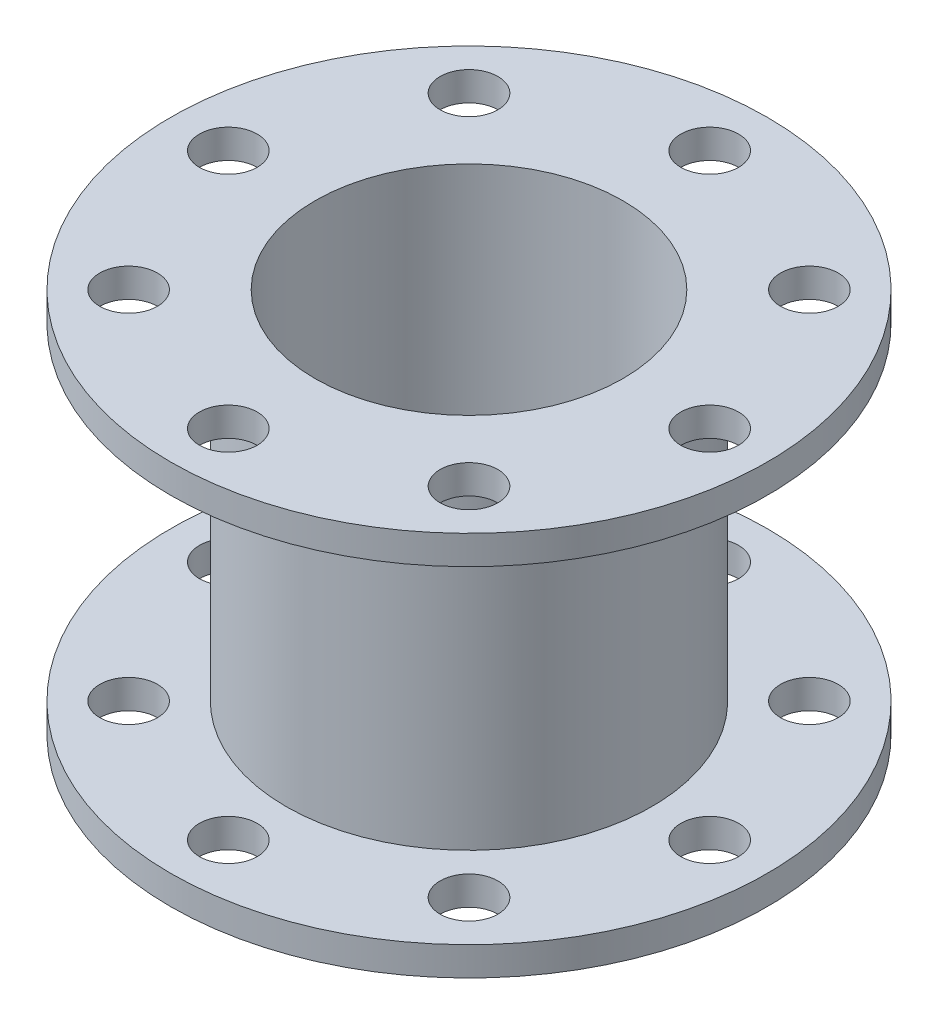
ISO-10303-21;
HEADER;
FILE_DESCRIPTION(('STEP AP214'),'2;1');
FILE_NAME('part.step','',(''),(''),'','','');
FILE_SCHEMA(('AUTOMOTIVE_DESIGN { 1 0 10303 214 1 1 1 1 }'));
ENDSEC;
DATA;
#1=APPLICATION_CONTEXT('core data for automotive mechanical design processes');
#2=APPLICATION_PROTOCOL_DEFINITION('international standard','automotive_design',2000,#1);
#3=PRODUCT_CONTEXT('',#1,'mechanical');
#4=PRODUCT('Part','Part','',(#3));
#5=PRODUCT_RELATED_PRODUCT_CATEGORY('part','',(#4));
#6=PRODUCT_DEFINITION_FORMATION('','',#4);
#7=PRODUCT_DEFINITION_CONTEXT('part definition',#1,'design');
#8=PRODUCT_DEFINITION('design','',#6,#7);
#9=PRODUCT_DEFINITION_SHAPE('','',#8);
#10=(LENGTH_UNIT() NAMED_UNIT(*) SI_UNIT(.MILLI.,.METRE.));
#11=(NAMED_UNIT(*) PLANE_ANGLE_UNIT() SI_UNIT($,.RADIAN.));
#12=(NAMED_UNIT(*) SI_UNIT($,.STERADIAN.) SOLID_ANGLE_UNIT());
#13=UNCERTAINTY_MEASURE_WITH_UNIT(LENGTH_MEASURE(1.E-05),#10,'distance_accuracy_value','');
#14=(GEOMETRIC_REPRESENTATION_CONTEXT(3) GLOBAL_UNCERTAINTY_ASSIGNED_CONTEXT((#13)) GLOBAL_UNIT_ASSIGNED_CONTEXT((#10,
#11,#12)) REPRESENTATION_CONTEXT('',''));
#15=CARTESIAN_POINT('',(0.,0.,0.));
#16=DIRECTION('',(0.,0.,1.));
#17=DIRECTION('',(1.,0.,0.));
#18=AXIS2_PLACEMENT_3D('',#15,#16,#17);
#19=CARTESIAN_POINT('',(31.,17.,0.));
#20=DIRECTION('',(0.,-1.,0.));
#21=DIRECTION('',(0.,0.,-1.));
#22=AXIS2_PLACEMENT_3D('',#19,#20,#21);
#23=PLANE('',#22);
#24=CARTESIAN_POINT('',(0.,17.,25.));
#25=DIRECTION('',(0.,-1.,0.));
#26=DIRECTION('',(0.,0.,-1.));
#27=AXIS2_PLACEMENT_3D('',#24,#25,#26);
#28=CIRCLE('',#27,3.);
#29=CARTESIAN_POINT('',(0.,17.,22.));
#30=VERTEX_POINT('',#29);
#31=EDGE_CURVE('E55',#30,#30,#28,.F.);
#32=ORIENTED_EDGE('',*,*,#31,.T.);
#33=EDGE_LOOP('',(#32));
#34=FACE_BOUND('',#33,.T.);
#35=CARTESIAN_POINT('',(-17.6776695296638,17.,17.6776695296636));
#36=DIRECTION('',(0.,-1.,0.));
#37=DIRECTION('',(0.,0.,-1.));
#38=AXIS2_PLACEMENT_3D('',#35,#36,#37);
#39=CIRCLE('',#38,3.);
#40=CARTESIAN_POINT('',(-17.6776695296638,17.,14.6776695296636));
#41=VERTEX_POINT('',#40);
#42=EDGE_CURVE('E99',#41,#41,#39,.F.);
#43=ORIENTED_EDGE('',*,*,#42,.T.);
#44=EDGE_LOOP('',(#43));
#45=FACE_BOUND('',#44,.T.);
#46=CARTESIAN_POINT('',(-25.,17.,0.));
#47=DIRECTION('',(0.,-1.,0.));
#48=DIRECTION('',(0.,0.,-1.));
#49=AXIS2_PLACEMENT_3D('',#46,#47,#48);
#50=CIRCLE('',#49,3.);
#51=CARTESIAN_POINT('',(-25.,17.,-3.));
#52=VERTEX_POINT('',#51);
#53=EDGE_CURVE('E82',#52,#52,#50,.F.);
#54=ORIENTED_EDGE('',*,*,#53,.T.);
#55=EDGE_LOOP('',(#54));
#56=FACE_BOUND('',#55,.T.);
#57=CARTESIAN_POINT('',(-17.6776695296635,17.,-17.6776695296638));
#58=DIRECTION('',(0.,-1.,0.));
#59=DIRECTION('',(0.,0.,-1.));
#60=AXIS2_PLACEMENT_3D('',#57,#58,#59);
#61=CIRCLE('',#60,3.);
#62=CARTESIAN_POINT('',(-17.6776695296635,17.,-20.6776695296638));
#63=VERTEX_POINT('',#62);
#64=EDGE_CURVE('E78',#63,#63,#61,.F.);
#65=ORIENTED_EDGE('',*,*,#64,.T.);
#66=EDGE_LOOP('',(#65));
#67=FACE_BOUND('',#66,.T.);
#68=CARTESIAN_POINT('',(2.61861100413235E-13,17.,-25.));
#69=DIRECTION('',(0.,-1.,0.));
#70=DIRECTION('',(0.,0.,-1.));
#71=AXIS2_PLACEMENT_3D('',#68,#69,#70);
#72=CIRCLE('',#71,3.);
#73=CARTESIAN_POINT('',(2.61861100413235E-13,17.,-28.));
#74=VERTEX_POINT('',#73);
#75=EDGE_CURVE('E74',#74,#74,#72,.F.);
#76=ORIENTED_EDGE('',*,*,#75,.T.);
#77=EDGE_LOOP('',(#76));
#78=FACE_BOUND('',#77,.T.);
#79=CARTESIAN_POINT('',(17.6776695296639,17.,-17.6776695296635));
#80=DIRECTION('',(0.,-1.,0.));
#81=DIRECTION('',(0.,0.,-1.));
#82=AXIS2_PLACEMENT_3D('',#79,#80,#81);
#83=CIRCLE('',#82,3.);
#84=CARTESIAN_POINT('',(17.6776695296639,17.,-20.6776695296635));
#85=VERTEX_POINT('',#84);
#86=EDGE_CURVE('E69',#85,#85,#83,.F.);
#87=ORIENTED_EDGE('',*,*,#86,.T.);
#88=EDGE_LOOP('',(#87));
#89=FACE_BOUND('',#88,.T.);
#90=CARTESIAN_POINT('',(17.6776695296637,17.,17.6776695296637));
#91=DIRECTION('',(0.,-1.,0.));
#92=DIRECTION('',(0.,0.,-1.));
#93=AXIS2_PLACEMENT_3D('',#90,#91,#92);
#94=CIRCLE('',#93,3.);
#95=CARTESIAN_POINT('',(17.6776695296637,17.,14.6776695296637));
#96=VERTEX_POINT('',#95);
#97=EDGE_CURVE('E64',#96,#96,#94,.F.);
#98=ORIENTED_EDGE('',*,*,#97,.T.);
#99=EDGE_LOOP('',(#98));
#100=FACE_BOUND('',#99,.T.);
#101=CARTESIAN_POINT('',(25.,17.,0.));
#102=DIRECTION('',(0.,-1.,0.));
#103=DIRECTION('',(0.,0.,-1.));
#104=AXIS2_PLACEMENT_3D('',#101,#102,#103);
#105=CIRCLE('',#104,3.);
#106=CARTESIAN_POINT('',(25.,17.,-3.));
#107=VERTEX_POINT('',#106);
#108=EDGE_CURVE('E115',#107,#107,#105,.F.);
#109=ORIENTED_EDGE('',*,*,#108,.T.);
#110=EDGE_LOOP('',(#109));
#111=FACE_BOUND('',#110,.T.);
#112=CARTESIAN_POINT('',(0.,17.,0.));
#113=DIRECTION('',(0.,-1.,0.));
#114=DIRECTION('',(0.,0.,-1.));
#115=AXIS2_PLACEMENT_3D('',#112,#113,#114);
#116=CIRCLE('',#115,31.);
#117=CARTESIAN_POINT('',(0.,17.,-31.));
#118=VERTEX_POINT('',#117);
#119=EDGE_CURVE('E10',#118,#118,#116,.T.);
#120=ORIENTED_EDGE('',*,*,#119,.T.);
#121=EDGE_LOOP('',(#120));
#122=FACE_BOUND('',#121,.T.);
#123=CARTESIAN_POINT('',(0.,17.,0.));
#124=DIRECTION('',(0.,-1.,0.));
#125=DIRECTION('',(0.,0.,-1.));
#126=AXIS2_PLACEMENT_3D('',#123,#124,#125);
#127=CIRCLE('',#126,19.);
#128=CARTESIAN_POINT('',(0.,17.,-19.));
#129=VERTEX_POINT('',#128);
#130=EDGE_CURVE('E118',#129,#129,#127,.T.);
#131=ORIENTED_EDGE('',*,*,#130,.F.);
#132=EDGE_LOOP('',(#131));
#133=FACE_BOUND('',#132,.T.);
#134=ADVANCED_FACE('F35',(#34,#45,#56,#67,#78,#89,#100,#111,#122,#133),#23,.T.);
#135=CARTESIAN_POINT('',(0.,0.,0.));
#136=DIRECTION('',(0.,-1.,0.));
#137=DIRECTION('',(0.,0.,-1.));
#138=AXIS2_PLACEMENT_3D('',#135,#136,#137);
#139=CYLINDRICAL_SURFACE('',#138,31.);
#140=CARTESIAN_POINT('',(0.,20.,0.));
#141=DIRECTION('',(0.,-1.,0.));
#142=DIRECTION('',(0.,0.,-1.));
#143=AXIS2_PLACEMENT_3D('',#140,#141,#142);
#144=CIRCLE('',#143,31.);
#145=CARTESIAN_POINT('',(0.,20.,-31.));
#146=VERTEX_POINT('',#145);
#147=EDGE_CURVE('E42',#146,#146,#144,.T.);
#148=ORIENTED_EDGE('',*,*,#147,.T.);
#149=EDGE_LOOP('',(#148));
#150=FACE_BOUND('',#149,.T.);
#151=ORIENTED_EDGE('',*,*,#119,.F.);
#152=EDGE_LOOP('',(#151));
#153=FACE_BOUND('',#152,.T.);
#154=ADVANCED_FACE('F150',(#150,#153),#139,.T.);
#155=CARTESIAN_POINT('',(16.,20.,0.));
#156=DIRECTION('',(0.,1.,0.));
#157=DIRECTION('',(0.,0.,1.));
#158=AXIS2_PLACEMENT_3D('',#155,#156,#157);
#159=PLANE('',#158);
#160=CARTESIAN_POINT('',(0.,20.,25.));
#161=DIRECTION('',(0.,1.,0.));
#162=DIRECTION('',(0.,0.,1.));
#163=AXIS2_PLACEMENT_3D('',#160,#161,#162);
#164=CIRCLE('',#163,3.);
#165=CARTESIAN_POINT('',(0.,20.,28.));
#166=VERTEX_POINT('',#165);
#167=EDGE_CURVE('E105',#166,#166,#164,.F.);
#168=ORIENTED_EDGE('',*,*,#167,.T.);
#169=EDGE_LOOP('',(#168));
#170=FACE_BOUND('',#169,.T.);
#171=CARTESIAN_POINT('',(-17.6776695296638,20.,17.6776695296636));
#172=DIRECTION('',(0.,1.,0.));
#173=DIRECTION('',(0.,0.,1.));
#174=AXIS2_PLACEMENT_3D('',#171,#172,#173);
#175=CIRCLE('',#174,3.);
#176=CARTESIAN_POINT('',(-17.6776695296638,20.,20.6776695296636));
#177=VERTEX_POINT('',#176);
#178=EDGE_CURVE('E86',#177,#177,#175,.F.);
#179=ORIENTED_EDGE('',*,*,#178,.T.);
#180=EDGE_LOOP('',(#179));
#181=FACE_BOUND('',#180,.T.);
#182=CARTESIAN_POINT('',(-25.,20.,0.));
#183=DIRECTION('',(0.,1.,0.));
#184=DIRECTION('',(0.,0.,1.));
#185=AXIS2_PLACEMENT_3D('',#182,#183,#184);
#186=CIRCLE('',#185,3.);
#187=CARTESIAN_POINT('',(-25.,20.,3.));
#188=VERTEX_POINT('',#187);
#189=EDGE_CURVE('E89',#188,#188,#186,.F.);
#190=ORIENTED_EDGE('',*,*,#189,.T.);
#191=EDGE_LOOP('',(#190));
#192=FACE_BOUND('',#191,.T.);
#193=CARTESIAN_POINT('',(-17.6776695296635,20.,-17.6776695296638));
#194=DIRECTION('',(0.,1.,0.));
#195=DIRECTION('',(0.,0.,1.));
#196=AXIS2_PLACEMENT_3D('',#193,#194,#195);
#197=CIRCLE('',#196,3.);
#198=CARTESIAN_POINT('',(-17.6776695296635,20.,-14.6776695296638));
#199=VERTEX_POINT('',#198);
#200=EDGE_CURVE('E266',#199,#199,#197,.F.);
#201=ORIENTED_EDGE('',*,*,#200,.T.);
#202=EDGE_LOOP('',(#201));
#203=FACE_BOUND('',#202,.T.);
#204=CARTESIAN_POINT('',(2.61861100413235E-13,20.,-25.));
#205=DIRECTION('',(0.,1.,0.));
#206=DIRECTION('',(0.,0.,1.));
#207=AXIS2_PLACEMENT_3D('',#204,#205,#206);
#208=CIRCLE('',#207,3.);
#209=CARTESIAN_POINT('',(2.61861100413235E-13,20.,-22.));
#210=VERTEX_POINT('',#209);
#211=EDGE_CURVE('E256',#210,#210,#208,.F.);
#212=ORIENTED_EDGE('',*,*,#211,.T.);
#213=EDGE_LOOP('',(#212));
#214=FACE_BOUND('',#213,.T.);
#215=CARTESIAN_POINT('',(17.6776695296639,20.,-17.6776695296635));
#216=DIRECTION('',(0.,1.,0.));
#217=DIRECTION('',(0.,0.,1.));
#218=AXIS2_PLACEMENT_3D('',#215,#216,#217);
#219=CIRCLE('',#218,3.);
#220=CARTESIAN_POINT('',(17.6776695296639,20.,-14.6776695296635));
#221=VERTEX_POINT('',#220);
#222=EDGE_CURVE('E307',#221,#221,#219,.F.);
#223=ORIENTED_EDGE('',*,*,#222,.T.);
#224=EDGE_LOOP('',(#223));
#225=FACE_BOUND('',#224,.T.);
#226=CARTESIAN_POINT('',(17.6776695296637,20.,17.6776695296637));
#227=DIRECTION('',(0.,1.,0.));
#228=DIRECTION('',(0.,0.,1.));
#229=AXIS2_PLACEMENT_3D('',#226,#227,#228);
#230=CIRCLE('',#229,3.);
#231=CARTESIAN_POINT('',(17.6776695296637,20.,20.6776695296637));
#232=VERTEX_POINT('',#231);
#233=EDGE_CURVE('E300',#232,#232,#230,.F.);
#234=ORIENTED_EDGE('',*,*,#233,.T.);
#235=EDGE_LOOP('',(#234));
#236=FACE_BOUND('',#235,.T.);
#237=CARTESIAN_POINT('',(25.,20.,0.));
#238=DIRECTION('',(0.,1.,0.));
#239=DIRECTION('',(0.,0.,1.));
#240=AXIS2_PLACEMENT_3D('',#237,#238,#239);
#241=CIRCLE('',#240,3.);
#242=CARTESIAN_POINT('',(25.,20.,3.));
#243=VERTEX_POINT('',#242);
#244=EDGE_CURVE('E112',#243,#243,#241,.F.);
#245=ORIENTED_EDGE('',*,*,#244,.T.);
#246=EDGE_LOOP('',(#245));
#247=FACE_BOUND('',#246,.T.);
#248=CARTESIAN_POINT('',(0.,20.,0.));
#249=DIRECTION('',(0.,-1.,0.));
#250=DIRECTION('',(0.,0.,-1.));
#251=AXIS2_PLACEMENT_3D('',#248,#249,#250);
#252=CIRCLE('',#251,16.);
#253=CARTESIAN_POINT('',(0.,20.,-16.));
#254=VERTEX_POINT('',#253);
#255=EDGE_CURVE('E47',#254,#254,#252,.T.);
#256=ORIENTED_EDGE('',*,*,#255,.T.);
#257=EDGE_LOOP('',(#256));
#258=FACE_BOUND('',#257,.T.);
#259=ORIENTED_EDGE('',*,*,#147,.F.);
#260=EDGE_LOOP('',(#259));
#261=FACE_BOUND('',#260,.T.);
#262=ADVANCED_FACE('F135',(#170,#181,#192,#203,#214,#225,#236,#247,#258,#261),#159,.T.);
#263=CARTESIAN_POINT('',(0.,0.,0.));
#264=DIRECTION('',(0.,-1.,0.));
#265=DIRECTION('',(0.,0.,-1.));
#266=AXIS2_PLACEMENT_3D('',#263,#264,#265);
#267=CYLINDRICAL_SURFACE('',#266,16.);
#268=CARTESIAN_POINT('',(0.,-20.,0.));
#269=DIRECTION('',(0.,-1.,0.));
#270=DIRECTION('',(0.,0.,-1.));
#271=AXIS2_PLACEMENT_3D('',#268,#269,#270);
#272=CIRCLE('',#271,16.);
#273=CARTESIAN_POINT('',(0.,-20.,-16.));
#274=VERTEX_POINT('',#273);
#275=EDGE_CURVE('E130',#274,#274,#272,.T.);
#276=ORIENTED_EDGE('',*,*,#275,.T.);
#277=EDGE_LOOP('',(#276));
#278=FACE_BOUND('',#277,.T.);
#279=ORIENTED_EDGE('',*,*,#255,.F.);
#280=EDGE_LOOP('',(#279));
#281=FACE_BOUND('',#280,.T.);
#282=ADVANCED_FACE('F138',(#278,#281),#267,.F.);
#283=CARTESIAN_POINT('',(31.,-20.,0.));
#284=DIRECTION('',(0.,-1.,0.));
#285=DIRECTION('',(0.,0.,-1.));
#286=AXIS2_PLACEMENT_3D('',#283,#284,#285);
#287=PLANE('',#286);
#288=CARTESIAN_POINT('',(0.,-20.,25.));
#289=DIRECTION('',(0.,-1.,0.));
#290=DIRECTION('',(0.,0.,-1.));
#291=AXIS2_PLACEMENT_3D('',#288,#289,#290);
#292=CIRCLE('',#291,3.);
#293=CARTESIAN_POINT('',(0.,-20.,22.));
#294=VERTEX_POINT('',#293);
#295=EDGE_CURVE('E102',#294,#294,#292,.F.);
#296=ORIENTED_EDGE('',*,*,#295,.T.);
#297=EDGE_LOOP('',(#296));
#298=FACE_BOUND('',#297,.T.);
#299=CARTESIAN_POINT('',(-17.6776695296638,-20.,17.6776695296636));
#300=DIRECTION('',(0.,-1.,0.));
#301=DIRECTION('',(0.,0.,-1.));
#302=AXIS2_PLACEMENT_3D('',#299,#300,#301);
#303=CIRCLE('',#302,3.);
#304=CARTESIAN_POINT('',(-17.6776695296638,-20.,14.6776695296636));
#305=VERTEX_POINT('',#304);
#306=EDGE_CURVE('E81',#305,#305,#303,.F.);
#307=ORIENTED_EDGE('',*,*,#306,.T.);
#308=EDGE_LOOP('',(#307));
#309=FACE_BOUND('',#308,.T.);
#310=CARTESIAN_POINT('',(-25.,-20.,0.));
#311=DIRECTION('',(0.,-1.,0.));
#312=DIRECTION('',(0.,0.,-1.));
#313=AXIS2_PLACEMENT_3D('',#310,#311,#312);
#314=CIRCLE('',#313,3.);
#315=CARTESIAN_POINT('',(-25.,-20.,-3.));
#316=VERTEX_POINT('',#315);
#317=EDGE_CURVE('E77',#316,#316,#314,.F.);
#318=ORIENTED_EDGE('',*,*,#317,.T.);
#319=EDGE_LOOP('',(#318));
#320=FACE_BOUND('',#319,.T.);
#321=CARTESIAN_POINT('',(-17.6776695296635,-20.,-17.6776695296638));
#322=DIRECTION('',(0.,-1.,0.));
#323=DIRECTION('',(0.,0.,-1.));
#324=AXIS2_PLACEMENT_3D('',#321,#322,#323);
#325=CIRCLE('',#324,3.);
#326=CARTESIAN_POINT('',(-17.6776695296635,-20.,-20.6776695296638));
#327=VERTEX_POINT('',#326);
#328=EDGE_CURVE('E73',#327,#327,#325,.F.);
#329=ORIENTED_EDGE('',*,*,#328,.T.);
#330=EDGE_LOOP('',(#329));
#331=FACE_BOUND('',#330,.T.);
#332=CARTESIAN_POINT('',(2.61861100413235E-13,-20.,-25.));
#333=DIRECTION('',(0.,-1.,0.));
#334=DIRECTION('',(0.,0.,-1.));
#335=AXIS2_PLACEMENT_3D('',#332,#333,#334);
#336=CIRCLE('',#335,3.);
#337=CARTESIAN_POINT('',(2.61861100413235E-13,-20.,-28.));
#338=VERTEX_POINT('',#337);
#339=EDGE_CURVE('E68',#338,#338,#336,.F.);
#340=ORIENTED_EDGE('',*,*,#339,.T.);
#341=EDGE_LOOP('',(#340));
#342=FACE_BOUND('',#341,.T.);
#343=CARTESIAN_POINT('',(17.6776695296639,-20.,-17.6776695296635));
#344=DIRECTION('',(0.,-1.,0.));
#345=DIRECTION('',(0.,0.,-1.));
#346=AXIS2_PLACEMENT_3D('',#343,#344,#345);
#347=CIRCLE('',#346,3.);
#348=CARTESIAN_POINT('',(17.6776695296639,-20.,-20.6776695296635));
#349=VERTEX_POINT('',#348);
#350=EDGE_CURVE('E63',#349,#349,#347,.F.);
#351=ORIENTED_EDGE('',*,*,#350,.T.);
#352=EDGE_LOOP('',(#351));
#353=FACE_BOUND('',#352,.T.);
#354=CARTESIAN_POINT('',(17.6776695296637,-20.,17.6776695296637));
#355=DIRECTION('',(0.,-1.,0.));
#356=DIRECTION('',(0.,0.,-1.));
#357=AXIS2_PLACEMENT_3D('',#354,#355,#356);
#358=CIRCLE('',#357,3.);
#359=CARTESIAN_POINT('',(17.6776695296637,-20.,14.6776695296637));
#360=VERTEX_POINT('',#359);
#361=EDGE_CURVE('E59',#360,#360,#358,.F.);
#362=ORIENTED_EDGE('',*,*,#361,.T.);
#363=EDGE_LOOP('',(#362));
#364=FACE_BOUND('',#363,.T.);
#365=CARTESIAN_POINT('',(25.,-20.,0.));
#366=DIRECTION('',(0.,-1.,0.));
#367=DIRECTION('',(0.,0.,-1.));
#368=AXIS2_PLACEMENT_3D('',#365,#366,#367);
#369=CIRCLE('',#368,3.);
#370=CARTESIAN_POINT('',(25.,-20.,-3.));
#371=VERTEX_POINT('',#370);
#372=EDGE_CURVE('E54',#371,#371,#369,.F.);
#373=ORIENTED_EDGE('',*,*,#372,.T.);
#374=EDGE_LOOP('',(#373));
#375=FACE_BOUND('',#374,.T.);
#376=CARTESIAN_POINT('',(0.,-20.,0.));
#377=DIRECTION('',(0.,-1.,0.));
#378=DIRECTION('',(0.,0.,-1.));
#379=AXIS2_PLACEMENT_3D('',#376,#377,#378);
#380=CIRCLE('',#379,31.);
#381=CARTESIAN_POINT('',(0.,-20.,-31.));
#382=VERTEX_POINT('',#381);
#383=EDGE_CURVE('E127',#382,#382,#380,.T.);
#384=ORIENTED_EDGE('',*,*,#383,.T.);
#385=EDGE_LOOP('',(#384));
#386=FACE_BOUND('',#385,.T.);
#387=ORIENTED_EDGE('',*,*,#275,.F.);
#388=EDGE_LOOP('',(#387));
#389=FACE_BOUND('',#388,.T.);
#390=ADVANCED_FACE('F140',(#298,#309,#320,#331,#342,#353,#364,#375,#386,#389),#287,.T.);
#391=CARTESIAN_POINT('',(0.,0.,0.));
#392=DIRECTION('',(0.,-1.,0.));
#393=DIRECTION('',(0.,0.,-1.));
#394=AXIS2_PLACEMENT_3D('',#391,#392,#393);
#395=CYLINDRICAL_SURFACE('',#394,31.);
#396=CARTESIAN_POINT('',(0.,-17.,0.));
#397=DIRECTION('',(0.,-1.,0.));
#398=DIRECTION('',(0.,0.,-1.));
#399=AXIS2_PLACEMENT_3D('',#396,#397,#398);
#400=CIRCLE('',#399,31.);
#401=CARTESIAN_POINT('',(0.,-17.,-31.));
#402=VERTEX_POINT('',#401);
#403=EDGE_CURVE('E124',#402,#402,#400,.T.);
#404=ORIENTED_EDGE('',*,*,#403,.T.);
#405=EDGE_LOOP('',(#404));
#406=FACE_BOUND('',#405,.T.);
#407=ORIENTED_EDGE('',*,*,#383,.F.);
#408=EDGE_LOOP('',(#407));
#409=FACE_BOUND('',#408,.T.);
#410=ADVANCED_FACE('F147',(#406,#409),#395,.T.);
#411=CARTESIAN_POINT('',(19.,-17.,0.));
#412=DIRECTION('',(0.,1.,0.));
#413=DIRECTION('',(0.,0.,1.));
#414=AXIS2_PLACEMENT_3D('',#411,#412,#413);
#415=PLANE('',#414);
#416=CARTESIAN_POINT('',(0.,-17.,25.));
#417=DIRECTION('',(0.,1.,0.));
#418=DIRECTION('',(0.,0.,1.));
#419=AXIS2_PLACEMENT_3D('',#416,#417,#418);
#420=CIRCLE('',#419,3.);
#421=CARTESIAN_POINT('',(0.,-17.,28.));
#422=VERTEX_POINT('',#421);
#423=EDGE_CURVE('E38',#422,#422,#420,.F.);
#424=ORIENTED_EDGE('',*,*,#423,.T.);
#425=EDGE_LOOP('',(#424));
#426=FACE_BOUND('',#425,.T.);
#427=CARTESIAN_POINT('',(-17.6776695296638,-17.,17.6776695296636));
#428=DIRECTION('',(0.,1.,0.));
#429=DIRECTION('',(0.,0.,1.));
#430=AXIS2_PLACEMENT_3D('',#427,#428,#429);
#431=CIRCLE('',#430,3.);
#432=CARTESIAN_POINT('',(-17.6776695296638,-17.,20.6776695296636));
#433=VERTEX_POINT('',#432);
#434=EDGE_CURVE('E79',#433,#433,#431,.F.);
#435=ORIENTED_EDGE('',*,*,#434,.T.);
#436=EDGE_LOOP('',(#435));
#437=FACE_BOUND('',#436,.T.);
#438=CARTESIAN_POINT('',(-25.,-17.,0.));
#439=DIRECTION('',(0.,1.,0.));
#440=DIRECTION('',(0.,0.,1.));
#441=AXIS2_PLACEMENT_3D('',#438,#439,#440);
#442=CIRCLE('',#441,3.);
#443=CARTESIAN_POINT('',(-25.,-17.,3.));
#444=VERTEX_POINT('',#443);
#445=EDGE_CURVE('E75',#444,#444,#442,.F.);
#446=ORIENTED_EDGE('',*,*,#445,.T.);
#447=EDGE_LOOP('',(#446));
#448=FACE_BOUND('',#447,.T.);
#449=CARTESIAN_POINT('',(-17.6776695296635,-17.,-17.6776695296638));
#450=DIRECTION('',(0.,1.,0.));
#451=DIRECTION('',(0.,0.,1.));
#452=AXIS2_PLACEMENT_3D('',#449,#450,#451);
#453=CIRCLE('',#452,3.);
#454=CARTESIAN_POINT('',(-17.6776695296635,-17.,-14.6776695296638));
#455=VERTEX_POINT('',#454);
#456=EDGE_CURVE('E70',#455,#455,#453,.F.);
#457=ORIENTED_EDGE('',*,*,#456,.T.);
#458=EDGE_LOOP('',(#457));
#459=FACE_BOUND('',#458,.T.);
#460=CARTESIAN_POINT('',(2.61861100413235E-13,-17.,-25.));
#461=DIRECTION('',(0.,1.,0.));
#462=DIRECTION('',(0.,0.,1.));
#463=AXIS2_PLACEMENT_3D('',#460,#461,#462);
#464=CIRCLE('',#463,3.);
#465=CARTESIAN_POINT('',(2.61861100413235E-13,-17.,-22.));
#466=VERTEX_POINT('',#465);
#467=EDGE_CURVE('E65',#466,#466,#464,.F.);
#468=ORIENTED_EDGE('',*,*,#467,.T.);
#469=EDGE_LOOP('',(#468));
#470=FACE_BOUND('',#469,.T.);
#471=CARTESIAN_POINT('',(17.6776695296639,-17.,-17.6776695296635));
#472=DIRECTION('',(0.,1.,0.));
#473=DIRECTION('',(0.,0.,1.));
#474=AXIS2_PLACEMENT_3D('',#471,#472,#473);
#475=CIRCLE('',#474,3.);
#476=CARTESIAN_POINT('',(17.6776695296639,-17.,-14.6776695296635));
#477=VERTEX_POINT('',#476);
#478=EDGE_CURVE('E60',#477,#477,#475,.F.);
#479=ORIENTED_EDGE('',*,*,#478,.T.);
#480=EDGE_LOOP('',(#479));
#481=FACE_BOUND('',#480,.T.);
#482=CARTESIAN_POINT('',(17.6776695296637,-17.,17.6776695296637));
#483=DIRECTION('',(0.,1.,0.));
#484=DIRECTION('',(0.,0.,1.));
#485=AXIS2_PLACEMENT_3D('',#482,#483,#484);
#486=CIRCLE('',#485,3.);
#487=CARTESIAN_POINT('',(17.6776695296637,-17.,20.6776695296637));
#488=VERTEX_POINT('',#487);
#489=EDGE_CURVE('E56',#488,#488,#486,.F.);
#490=ORIENTED_EDGE('',*,*,#489,.T.);
#491=EDGE_LOOP('',(#490));
#492=FACE_BOUND('',#491,.T.);
#493=CARTESIAN_POINT('',(25.,-17.,0.));
#494=DIRECTION('',(0.,1.,0.));
#495=DIRECTION('',(0.,0.,1.));
#496=AXIS2_PLACEMENT_3D('',#493,#494,#495);
#497=CIRCLE('',#496,3.);
#498=CARTESIAN_POINT('',(25.,-17.,3.));
#499=VERTEX_POINT('',#498);
#500=EDGE_CURVE('E51',#499,#499,#497,.F.);
#501=ORIENTED_EDGE('',*,*,#500,.T.);
#502=EDGE_LOOP('',(#501));
#503=FACE_BOUND('',#502,.T.);
#504=CARTESIAN_POINT('',(0.,-17.,0.));
#505=DIRECTION('',(0.,-1.,0.));
#506=DIRECTION('',(0.,0.,-1.));
#507=AXIS2_PLACEMENT_3D('',#504,#505,#506);
#508=CIRCLE('',#507,19.);
#509=CARTESIAN_POINT('',(0.,-17.,-19.));
#510=VERTEX_POINT('',#509);
#511=EDGE_CURVE('E121',#510,#510,#508,.T.);
#512=ORIENTED_EDGE('',*,*,#511,.T.);
#513=EDGE_LOOP('',(#512));
#514=FACE_BOUND('',#513,.T.);
#515=ORIENTED_EDGE('',*,*,#403,.F.);
#516=EDGE_LOOP('',(#515));
#517=FACE_BOUND('',#516,.T.);
#518=ADVANCED_FACE('F183',(#426,#437,#448,#459,#470,#481,#492,#503,#514,#517),#415,.T.);
#519=CARTESIAN_POINT('',(0.,0.,0.));
#520=DIRECTION('',(0.,-1.,0.));
#521=DIRECTION('',(0.,0.,-1.));
#522=AXIS2_PLACEMENT_3D('',#519,#520,#521);
#523=CYLINDRICAL_SURFACE('',#522,19.);
#524=ORIENTED_EDGE('',*,*,#130,.T.);
#525=EDGE_LOOP('',(#524));
#526=FACE_BOUND('',#525,.T.);
#527=ORIENTED_EDGE('',*,*,#511,.F.);
#528=EDGE_LOOP('',(#527));
#529=FACE_BOUND('',#528,.T.);
#530=ADVANCED_FACE('F179',(#526,#529),#523,.T.);
#531=CARTESIAN_POINT('',(25.,483.,0.));
#532=DIRECTION('',(0.,-1.,0.));
#533=DIRECTION('',(0.,0.,-1.));
#534=AXIS2_PLACEMENT_3D('',#531,#532,#533);
#535=CYLINDRICAL_SURFACE('',#534,3.);
#536=ORIENTED_EDGE('',*,*,#372,.F.);
#537=EDGE_LOOP('',(#536));
#538=FACE_BOUND('',#537,.T.);
#539=ORIENTED_EDGE('',*,*,#500,.F.);
#540=EDGE_LOOP('',(#539));
#541=FACE_BOUND('',#540,.T.);
#542=ADVANCED_FACE('F182',(#538,#541),#535,.F.);
#543=ORIENTED_EDGE('',*,*,#108,.F.);
#544=EDGE_LOOP('',(#543));
#545=FACE_BOUND('',#544,.T.);
#546=ORIENTED_EDGE('',*,*,#244,.F.);
#547=EDGE_LOOP('',(#546));
#548=FACE_BOUND('',#547,.T.);
#549=ADVANCED_FACE('F205',(#545,#548),#535,.F.);
#550=CARTESIAN_POINT('',(17.6776695296637,483.,17.6776695296637));
#551=DIRECTION('',(0.,-1.,0.));
#552=DIRECTION('',(0.,0.,-1.));
#553=AXIS2_PLACEMENT_3D('',#550,#551,#552);
#554=CYLINDRICAL_SURFACE('',#553,3.);
#555=ORIENTED_EDGE('',*,*,#361,.F.);
#556=EDGE_LOOP('',(#555));
#557=FACE_BOUND('',#556,.T.);
#558=ORIENTED_EDGE('',*,*,#489,.F.);
#559=EDGE_LOOP('',(#558));
#560=FACE_BOUND('',#559,.T.);
#561=ADVANCED_FACE('F207',(#557,#560),#554,.F.);
#562=CARTESIAN_POINT('',(17.6776695296639,483.,-17.6776695296635));
#563=DIRECTION('',(0.,-1.,0.));
#564=DIRECTION('',(0.,0.,-1.));
#565=AXIS2_PLACEMENT_3D('',#562,#563,#564);
#566=CYLINDRICAL_SURFACE('',#565,3.);
#567=ORIENTED_EDGE('',*,*,#350,.F.);
#568=EDGE_LOOP('',(#567));
#569=FACE_BOUND('',#568,.T.);
#570=ORIENTED_EDGE('',*,*,#478,.F.);
#571=EDGE_LOOP('',(#570));
#572=FACE_BOUND('',#571,.T.);
#573=ADVANCED_FACE('F210',(#569,#572),#566,.F.);
#574=CARTESIAN_POINT('',(2.61861100413235E-13,483.,-25.));
#575=DIRECTION('',(0.,-1.,0.));
#576=DIRECTION('',(0.,0.,-1.));
#577=AXIS2_PLACEMENT_3D('',#574,#575,#576);
#578=CYLINDRICAL_SURFACE('',#577,3.);
#579=ORIENTED_EDGE('',*,*,#339,.F.);
#580=EDGE_LOOP('',(#579));
#581=FACE_BOUND('',#580,.T.);
#582=ORIENTED_EDGE('',*,*,#467,.F.);
#583=EDGE_LOOP('',(#582));
#584=FACE_BOUND('',#583,.T.);
#585=ADVANCED_FACE('F217',(#581,#584),#578,.F.);
#586=CARTESIAN_POINT('',(-17.6776695296635,483.,-17.6776695296638));
#587=DIRECTION('',(0.,-1.,0.));
#588=DIRECTION('',(0.,0.,-1.));
#589=AXIS2_PLACEMENT_3D('',#586,#587,#588);
#590=CYLINDRICAL_SURFACE('',#589,3.);
#591=ORIENTED_EDGE('',*,*,#328,.F.);
#592=EDGE_LOOP('',(#591));
#593=FACE_BOUND('',#592,.T.);
#594=ORIENTED_EDGE('',*,*,#456,.F.);
#595=EDGE_LOOP('',(#594));
#596=FACE_BOUND('',#595,.T.);
#597=ADVANCED_FACE('F213',(#593,#596),#590,.F.);
#598=CARTESIAN_POINT('',(-25.,483.,0.));
#599=DIRECTION('',(0.,-1.,0.));
#600=DIRECTION('',(0.,0.,-1.));
#601=AXIS2_PLACEMENT_3D('',#598,#599,#600);
#602=CYLINDRICAL_SURFACE('',#601,3.);
#603=ORIENTED_EDGE('',*,*,#317,.F.);
#604=EDGE_LOOP('',(#603));
#605=FACE_BOUND('',#604,.T.);
#606=ORIENTED_EDGE('',*,*,#445,.F.);
#607=EDGE_LOOP('',(#606));
#608=FACE_BOUND('',#607,.T.);
#609=ADVANCED_FACE('F216',(#605,#608),#602,.F.);
#610=CARTESIAN_POINT('',(-17.6776695296638,483.,17.6776695296636));
#611=DIRECTION('',(0.,-1.,0.));
#612=DIRECTION('',(0.,0.,-1.));
#613=AXIS2_PLACEMENT_3D('',#610,#611,#612);
#614=CYLINDRICAL_SURFACE('',#613,3.);
#615=ORIENTED_EDGE('',*,*,#306,.F.);
#616=EDGE_LOOP('',(#615));
#617=FACE_BOUND('',#616,.T.);
#618=ORIENTED_EDGE('',*,*,#434,.F.);
#619=EDGE_LOOP('',(#618));
#620=FACE_BOUND('',#619,.T.);
#621=ADVANCED_FACE('F222',(#617,#620),#614,.F.);
#622=CARTESIAN_POINT('',(0.,483.,25.));
#623=DIRECTION('',(0.,-1.,0.));
#624=DIRECTION('',(0.,0.,-1.));
#625=AXIS2_PLACEMENT_3D('',#622,#623,#624);
#626=CYLINDRICAL_SURFACE('',#625,3.);
#627=ORIENTED_EDGE('',*,*,#295,.F.);
#628=EDGE_LOOP('',(#627));
#629=FACE_BOUND('',#628,.T.);
#630=ORIENTED_EDGE('',*,*,#423,.F.);
#631=EDGE_LOOP('',(#630));
#632=FACE_BOUND('',#631,.T.);
#633=ADVANCED_FACE('F227',(#629,#632),#626,.F.);
#634=ORIENTED_EDGE('',*,*,#97,.F.);
#635=EDGE_LOOP('',(#634));
#636=FACE_BOUND('',#635,.T.);
#637=ORIENTED_EDGE('',*,*,#233,.F.);
#638=EDGE_LOOP('',(#637));
#639=FACE_BOUND('',#638,.T.);
#640=ADVANCED_FACE('F212',(#636,#639),#554,.F.);
#641=ORIENTED_EDGE('',*,*,#86,.F.);
#642=EDGE_LOOP('',(#641));
#643=FACE_BOUND('',#642,.T.);
#644=ORIENTED_EDGE('',*,*,#222,.F.);
#645=EDGE_LOOP('',(#644));
#646=FACE_BOUND('',#645,.T.);
#647=ADVANCED_FACE('F237',(#643,#646),#566,.F.);
#648=ORIENTED_EDGE('',*,*,#75,.F.);
#649=EDGE_LOOP('',(#648));
#650=FACE_BOUND('',#649,.T.);
#651=ORIENTED_EDGE('',*,*,#211,.F.);
#652=EDGE_LOOP('',(#651));
#653=FACE_BOUND('',#652,.T.);
#654=ADVANCED_FACE('F240',(#650,#653),#578,.F.);
#655=ORIENTED_EDGE('',*,*,#64,.F.);
#656=EDGE_LOOP('',(#655));
#657=FACE_BOUND('',#656,.T.);
#658=ORIENTED_EDGE('',*,*,#200,.F.);
#659=EDGE_LOOP('',(#658));
#660=FACE_BOUND('',#659,.T.);
#661=ADVANCED_FACE('F219',(#657,#660),#590,.F.);
#662=ORIENTED_EDGE('',*,*,#53,.F.);
#663=EDGE_LOOP('',(#662));
#664=FACE_BOUND('',#663,.T.);
#665=ORIENTED_EDGE('',*,*,#189,.F.);
#666=EDGE_LOOP('',(#665));
#667=FACE_BOUND('',#666,.T.);
#668=ADVANCED_FACE('F224',(#664,#667),#602,.F.);
#669=ORIENTED_EDGE('',*,*,#42,.F.);
#670=EDGE_LOOP('',(#669));
#671=FACE_BOUND('',#670,.T.);
#672=ORIENTED_EDGE('',*,*,#178,.F.);
#673=EDGE_LOOP('',(#672));
#674=FACE_BOUND('',#673,.T.);
#675=ADVANCED_FACE('F229',(#671,#674),#614,.F.);
#676=ORIENTED_EDGE('',*,*,#31,.F.);
#677=EDGE_LOOP('',(#676));
#678=FACE_BOUND('',#677,.T.);
#679=ORIENTED_EDGE('',*,*,#167,.F.);
#680=EDGE_LOOP('',(#679));
#681=FACE_BOUND('',#680,.T.);
#682=ADVANCED_FACE('F233',(#678,#681),#626,.F.);
#683=CLOSED_SHELL('',(#134,#154,#262,#282,#390,#410,#518,#530,#542,#549,#561,#573,#585,#597,
#609,#621,#633,#640,#647,#654,#661,#668,#675,#682));
#684=MANIFOLD_SOLID_BREP('B2',#683);
#685=ADVANCED_BREP_SHAPE_REPRESENTATION('',(#18,#684),#14);
#686=SHAPE_DEFINITION_REPRESENTATION(#9,#685);
ENDSEC;
END-ISO-10303-21;
